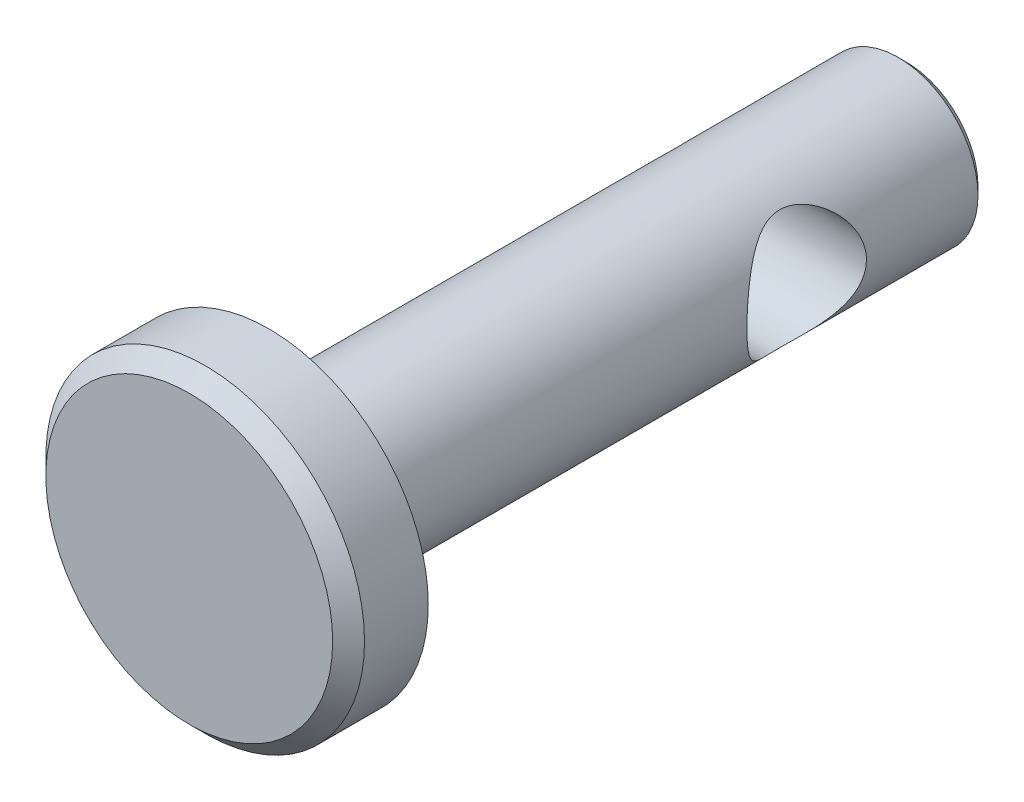
ISO-10303-21;
HEADER;
FILE_DESCRIPTION(('STEP AP214'),'2;1');
FILE_NAME('part.step','',(''),(''),'','','');
FILE_SCHEMA(('AUTOMOTIVE_DESIGN { 1 0 10303 214 1 1 1 1 }'));
ENDSEC;
DATA;
#1=APPLICATION_CONTEXT('core data for automotive mechanical design processes');
#2=APPLICATION_PROTOCOL_DEFINITION('international standard','automotive_design',2000,#1);
#3=PRODUCT_CONTEXT('',#1,'mechanical');
#4=PRODUCT('Part','Part','',(#3));
#5=PRODUCT_RELATED_PRODUCT_CATEGORY('part','',(#4));
#6=PRODUCT_DEFINITION_FORMATION('','',#4);
#7=PRODUCT_DEFINITION_CONTEXT('part definition',#1,'design');
#8=PRODUCT_DEFINITION('design','',#6,#7);
#9=PRODUCT_DEFINITION_SHAPE('','',#8);
#10=(LENGTH_UNIT() NAMED_UNIT(*) SI_UNIT(.MILLI.,.METRE.));
#11=(NAMED_UNIT(*) PLANE_ANGLE_UNIT() SI_UNIT($,.RADIAN.));
#12=(NAMED_UNIT(*) SI_UNIT($,.STERADIAN.) SOLID_ANGLE_UNIT());
#13=UNCERTAINTY_MEASURE_WITH_UNIT(LENGTH_MEASURE(1.E-05),#10,'distance_accuracy_value','');
#14=(GEOMETRIC_REPRESENTATION_CONTEXT(3) GLOBAL_UNCERTAINTY_ASSIGNED_CONTEXT((#13)) GLOBAL_UNIT_ASSIGNED_CONTEXT((#10,
#11,#12)) REPRESENTATION_CONTEXT('',''));
#15=CARTESIAN_POINT('',(0.,0.,0.));
#16=DIRECTION('',(0.,0.,1.));
#17=DIRECTION('',(1.,0.,0.));
#18=AXIS2_PLACEMENT_3D('',#15,#16,#17);
#19=CARTESIAN_POINT('',(0.,0.,6.35));
#20=DIRECTION('',(0.,0.,-1.));
#21=DIRECTION('',(-1.,0.,0.));
#22=AXIS2_PLACEMENT_3D('',#19,#20,#21);
#23=CYLINDRICAL_SURFACE('',#22,1.5875);
#24=CARTESIAN_POINT('',(0.,0.,-6.19125));
#25=DIRECTION('',(0.,0.,1.));
#26=DIRECTION('',(1.,0.,0.));
#27=AXIS2_PLACEMENT_3D('',#24,#25,#26);
#28=CIRCLE('',#27,1.5875);
#29=CARTESIAN_POINT('',(1.5875,0.,-6.19125));
#30=VERTEX_POINT('',#29);
#31=EDGE_CURVE('E39',#30,#30,#28,.T.);
#32=ORIENTED_EDGE('',*,*,#31,.T.);
#33=EDGE_LOOP('',(#32));
#34=FACE_BOUND('',#33,.T.);
#35=CARTESIAN_POINT('',(-1.5875,0.,-1.5875));
#36=CARTESIAN_POINT('',(-1.58749293550487,-0.0581345903619636,-1.58750751736506));
#37=CARTESIAN_POINT('',(-1.5842736454738,-0.116337035476692,-1.59179123415719));
#38=CARTESIAN_POINT('',(-1.57167836349025,-0.230926561501124,-1.60866598301441));
#39=CARTESIAN_POINT('',(-1.56228689316245,-0.287308703602339,-1.62127790062677));
#40=CARTESIAN_POINT('',(-1.53825292604917,-0.396268601409065,-1.65394738700866));
#41=CARTESIAN_POINT('',(-1.5236423654175,-0.448867207249459,-1.6739596976754));
#42=CARTESIAN_POINT('',(-1.49027010950212,-0.549609928884543,-1.72048666443958));
#43=CARTESIAN_POINT('',(-1.47150962872228,-0.597755342103896,-1.74699941838126));
#44=CARTESIAN_POINT('',(-1.42914323984027,-0.693313679409797,-1.80837128717648));
#45=CARTESIAN_POINT('',(-1.40524950621394,-0.740245900404435,-1.84377594851999));
#46=CARTESIAN_POINT('',(-1.35546320984701,-0.82790278963518,-1.92047481503523));
#47=CARTESIAN_POINT('',(-1.32956759006665,-0.868617669733832,-1.96177811276729));
#48=CARTESIAN_POINT('',(-1.27215204210137,-0.951207477538763,-2.0586564712163));
#49=CARTESIAN_POINT('',(-1.24055865999076,-0.991636468498788,-2.11542604425694));
#50=CARTESIAN_POINT('',(-1.1803970925182,-1.06252960824742,-2.23635174052509));
#51=CARTESIAN_POINT('',(-1.15182480849321,-1.0930073780619,-2.30049760312805));
#52=CARTESIAN_POINT('',(-1.11106866917438,-1.13411498357852,-2.41260537827536));
#53=CARTESIAN_POINT('',(-1.09662715003243,-1.14796629108587,-2.45855386586475));
#54=CARTESIAN_POINT('',(-1.0729245285833,-1.17015158839656,-2.55301173321647));
#55=CARTESIAN_POINT('',(-1.06365157402314,-1.17849820935624,-2.60151497243773));
#56=CARTESIAN_POINT('',(-1.0517485925154,-1.18913927577415,-2.70048242726543));
#57=CARTESIAN_POINT('',(-1.04917896183533,-1.19137870417301,-2.75096034031936));
#58=CARTESIAN_POINT('',(-1.05139753338266,-1.18942019258959,-2.85163808553011));
#59=CARTESIAN_POINT('',(-1.05618837351597,-1.18521994470442,-2.90183781151625));
#60=CARTESIAN_POINT('',(-1.07130550994751,-1.17155705567151,-2.99497063193861));
#61=CARTESIAN_POINT('',(-1.08098556023457,-1.16270473579084,-3.03810699425691));
#62=CARTESIAN_POINT('',(-1.10421890680931,-1.14066376466568,-3.12216710972328));
#63=CARTESIAN_POINT('',(-1.11777592426019,-1.12747094551454,-3.16308869200372));
#64=CARTESIAN_POINT('',(-1.15682529319326,-1.08769994678833,-3.26727850704296));
#65=CARTESIAN_POINT('',(-1.18447858988687,-1.05791117864918,-3.32851158075162));
#66=CARTESIAN_POINT('',(-1.24248305418366,-0.989155560080841,-3.44423724078015));
#67=CARTESIAN_POINT('',(-1.2728406637008,-0.950166408786953,-3.4987129505223));
#68=CARTESIAN_POINT('',(-1.33391014894222,-0.862422107554635,-3.60184175364427));
#69=CARTESIAN_POINT('',(-1.36461171965975,-0.813445918236304,-3.6503138567152));
#70=CARTESIAN_POINT('',(-1.42278130148547,-0.706772876608597,-3.73877176962953));
#71=CARTESIAN_POINT('',(-1.45025545184636,-0.649093074346057,-3.77877381168214));
#72=CARTESIAN_POINT('',(-1.49447032570734,-0.538084776360168,-3.84173475939759));
#73=CARTESIAN_POINT('',(-1.51225861937541,-0.486203521959755,-3.86650277165893));
#74=CARTESIAN_POINT('',(-1.54283492881011,-0.37810453747924,-3.90860349886804));
#75=CARTESIAN_POINT('',(-1.55562607581595,-0.321889549469388,-3.92594087055876));
#76=CARTESIAN_POINT('',(-1.57516185979801,-0.206118009533772,-3.95228235679115));
#77=CARTESIAN_POINT('',(-1.58186908171322,-0.146543142115963,-3.96123491703255));
#78=CARTESIAN_POINT('',(-1.58841982654688,-0.0263534840888105,-3.96997999291378));
#79=CARTESIAN_POINT('',(-1.58826624533544,0.0342608569708462,-3.96977637327694));
#80=CARTESIAN_POINT('',(-1.58148771820849,0.14827584750539,-3.96072449751441));
#81=CARTESIAN_POINT('',(-1.57551506239068,0.201788972489742,-3.95274757384462));
#82=CARTESIAN_POINT('',(-1.55853860410011,0.306475344795986,-3.92987706211876));
#83=CARTESIAN_POINT('',(-1.54753373108889,0.357648091683638,-3.91498200230903));
#84=CARTESIAN_POINT('',(-1.5208236560488,0.458324568878753,-3.87835177259173));
#85=CARTESIAN_POINT('',(-1.50496627417841,0.507705655700557,-3.85639374974201));
#86=CARTESIAN_POINT('',(-1.46976294670745,0.60207408084044,-3.80668811350594));
#87=CARTESIAN_POINT('',(-1.45041651854828,0.647060810060777,-3.77893969918596));
#88=CARTESIAN_POINT('',(-1.40588322841159,0.739387353390724,-3.71333454816161));
#89=CARTESIAN_POINT('',(-1.38026056676124,0.785865492892053,-3.67456359682151));
#90=CARTESIAN_POINT('',(-1.32745918844359,0.872108800418378,-3.59091805263298));
#91=CARTESIAN_POINT('',(-1.3002771056524,0.911858654352413,-3.54602994461845));
#92=CARTESIAN_POINT('',(-1.24117995581381,0.991215482287605,-3.441581031987));
#93=CARTESIAN_POINT('',(-1.20934732825353,1.02935915896087,-3.38085306056522));
#94=CARTESIAN_POINT('',(-1.15046594382809,1.09476568573709,-3.25170793810963));
#95=CARTESIAN_POINT('',(-1.1234031028437,1.12206087909462,-3.18331443448606));
#96=CARTESIAN_POINT('',(-1.08838109260616,1.15582489066144,-3.06751478120528));
#97=CARTESIAN_POINT('',(-1.07708550635911,1.16626488800437,-3.02228954341626));
#98=CARTESIAN_POINT('',(-1.05999007031602,1.1818264573239,-2.92996378145895));
#99=CARTESIAN_POINT('',(-1.05417795592964,1.18695990066239,-2.8828676889825));
#100=CARTESIAN_POINT('',(-1.04900096423164,1.19154035414093,-2.78778566789294));
#101=CARTESIAN_POINT('',(-1.04966881670936,1.19095849657507,-2.73979644521068));
#102=CARTESIAN_POINT('',(-1.05740556029295,1.18409151553515,-2.64472988426598));
#103=CARTESIAN_POINT('',(-1.06448271154137,1.17779903232889,-2.59765380282681));
#104=CARTESIAN_POINT('',(-1.08598770618424,1.15803236912881,-2.49561780882663));
#105=CARTESIAN_POINT('',(-1.10168297890217,1.14329025684,-2.44118036279259));
#106=CARTESIAN_POINT('',(-1.13810227145168,1.10704016772387,-2.33637546421904));
#107=CARTESIAN_POINT('',(-1.15883896333654,1.08551510031168,-2.28601870093093));
#108=CARTESIAN_POINT('',(-1.21059954092525,1.02789766245492,-2.17287424712876));
#109=CARTESIAN_POINT('',(-1.24269662205451,0.989342211616041,-2.1118341081835));
#110=CARTESIAN_POINT('',(-1.30741347783049,0.902102606381482,-1.99776871231258));
#111=CARTESIAN_POINT('',(-1.34003369413069,0.853409427337072,-1.9447506698021));
#112=CARTESIAN_POINT('',(-1.40278638481485,0.74582893771658,-1.84718968521524));
#113=CARTESIAN_POINT('',(-1.43289615544478,0.686860964920876,-1.80272014663381));
#114=CARTESIAN_POINT('',(-1.48714835544475,0.559720440868621,-1.72464185265254));
#115=CARTESIAN_POINT('',(-1.5113049999054,0.491570429282554,-1.69100716517885));
#116=CARTESIAN_POINT('',(-1.54492918912427,0.36896590978973,-1.64480881542714));
#117=CARTESIAN_POINT('',(-1.55662680105537,0.316348479361373,-1.6289588859998));
#118=CARTESIAN_POINT('',(-1.57466982293622,0.208633970914951,-1.60463205720135));
#119=CARTESIAN_POINT('',(-1.58103017903459,0.153544275563068,-1.59613456638521));
#120=CARTESIAN_POINT('',(-1.58648947610023,0.0654477992947602,-1.58884736125639));
#121=CARTESIAN_POINT('',(-1.58750397790407,0.0327346567825816,-1.58749576709213));
#122=CARTESIAN_POINT('',(-1.5875,0.,-1.5875));
#123=B_SPLINE_CURVE_WITH_KNOTS('',3,(#35,#36,#37,#38,#39,#40,#41,#42,#43,#44,#45,#46,#47,#48,
#49,#50,#51,#52,#53,#54,#55,#56,#57,#58,#59,#60,#61,#62,#63,#64,#65,#66,#67,#68,#69,#70,#71,#72,
#73,#74,#75,#76,#77,#78,#79,#80,#81,#82,#83,#84,#85,#86,#87,#88,#89,#90,#91,#92,#93,#94,#95,#96,
#97,#98,#99,#100,#101,#102,#103,#104,#105,#106,#107,#108,#109,#110,#111,#112,#113,#114,#115,
#116,#117,#118,#119,#120,#121,#122),.UNSPECIFIED.,.T.,.F.,(4,2,2,2,2,2,2,2,2,2,2,2,2,2,2,2,2,2,
2,2,2,2,2,2,2,2,2,2,2,2,2,2,2,2,2,2,2,2,2,2,2,2,2,4),(0.,0.174285105591558,0.3490089535422,
0.522681464773872,0.696303216586626,0.886003048582098,1.07599851796598,1.30460762610664,
1.53290249407352,1.68274617833109,1.83224482098762,1.98308585174373,2.13398095475791,
2.26875094061606,2.40365071711279,2.62294157111712,2.84276952674846,3.06812857866631,
3.29305175845138,3.47286663339593,3.65256865394996,3.83336846160747,4.01409195636146,
4.17664254681542,4.3392277338826,4.50755098830942,4.67589754085445,4.87235803268254,
5.06925983997974,5.30358823078429,5.53721266696798,5.67998896870224,5.82244516787674,
5.96562127487972,6.10898216663331,6.28363988815378,6.45874125070584,6.69458470773787,
6.93063901826043,7.16863763025562,7.40606231082595,7.5739283491444,7.74132272115606,
7.83945987286443),.UNSPECIFIED.);
#124=CARTESIAN_POINT('',(-1.5875,0.,-1.5875));
#125=VERTEX_POINT('',#124);
#126=EDGE_CURVE('E50',#125,#125,#123,.T.);
#127=ORIENTED_EDGE('',*,*,#126,.T.);
#128=EDGE_LOOP('',(#127));
#129=FACE_BOUND('',#128,.T.);
#130=CARTESIAN_POINT('',(1.5875,0.,-3.96875));
#131=CARTESIAN_POINT('',(1.58749293550487,-0.0581345903619637,-3.96874248263494));
#132=CARTESIAN_POINT('',(1.5842736454738,-0.116337035476692,-3.96445876584281));
#133=CARTESIAN_POINT('',(1.57167836349025,-0.230926561501124,-3.94758401698559));
#134=CARTESIAN_POINT('',(1.56228689316245,-0.287308703602339,-3.93497209937323));
#135=CARTESIAN_POINT('',(1.53825292604917,-0.396268601409065,-3.90230261299134));
#136=CARTESIAN_POINT('',(1.5236423654175,-0.448867207249459,-3.8822903023246));
#137=CARTESIAN_POINT('',(1.49027010950212,-0.549609928884543,-3.83576333556042));
#138=CARTESIAN_POINT('',(1.47150962872228,-0.597755342103897,-3.80925058161874));
#139=CARTESIAN_POINT('',(1.42914323984027,-0.693313679409798,-3.74787871282352));
#140=CARTESIAN_POINT('',(1.40524950621394,-0.740245900404435,-3.71247405148001));
#141=CARTESIAN_POINT('',(1.35546320984701,-0.82790278963518,-3.63577518496477));
#142=CARTESIAN_POINT('',(1.32956759006665,-0.868617669733832,-3.59447188723271));
#143=CARTESIAN_POINT('',(1.27215204210136,-0.951207477538763,-3.4975935287837));
#144=CARTESIAN_POINT('',(1.24055865999076,-0.991636468498789,-3.44082395574305));
#145=CARTESIAN_POINT('',(1.1803970925182,-1.06252960824742,-3.3198982594749));
#146=CARTESIAN_POINT('',(1.15182480849321,-1.0930073780619,-3.25575239687195));
#147=CARTESIAN_POINT('',(1.11106866917438,-1.13411498357852,-3.14364462172464));
#148=CARTESIAN_POINT('',(1.09662715003243,-1.14796629108587,-3.09769613413525));
#149=CARTESIAN_POINT('',(1.0729245285833,-1.17015158839656,-3.00323826678353));
#150=CARTESIAN_POINT('',(1.06365157402314,-1.17849820935624,-2.95473502756227));
#151=CARTESIAN_POINT('',(1.0517485925154,-1.18913927577415,-2.85576757273457));
#152=CARTESIAN_POINT('',(1.04917896183533,-1.19137870417301,-2.80528965968064));
#153=CARTESIAN_POINT('',(1.05139753338266,-1.18942019258959,-2.70461191446989));
#154=CARTESIAN_POINT('',(1.05618837351597,-1.18521994470442,-2.65441218848375));
#155=CARTESIAN_POINT('',(1.07130550994751,-1.17155705567151,-2.56127936806139));
#156=CARTESIAN_POINT('',(1.08098556023457,-1.16270473579084,-2.51814300574309));
#157=CARTESIAN_POINT('',(1.10421890680931,-1.14066376466568,-2.43408289027672));
#158=CARTESIAN_POINT('',(1.11777592426019,-1.12747094551454,-2.39316130799628));
#159=CARTESIAN_POINT('',(1.15682529319326,-1.08769994678833,-2.28897149295704));
#160=CARTESIAN_POINT('',(1.18447858988687,-1.05791117864918,-2.22773841924838));
#161=CARTESIAN_POINT('',(1.24248305418366,-0.989155560080841,-2.11201275921985));
#162=CARTESIAN_POINT('',(1.2728406637008,-0.950166408786953,-2.0575370494777));
#163=CARTESIAN_POINT('',(1.33391014894222,-0.862422107554635,-1.95440824635573));
#164=CARTESIAN_POINT('',(1.36461171965975,-0.813445918236304,-1.9059361432848));
#165=CARTESIAN_POINT('',(1.42278130148547,-0.706772876608597,-1.81747823037047));
#166=CARTESIAN_POINT('',(1.45025545184636,-0.649093074346057,-1.77747618831786));
#167=CARTESIAN_POINT('',(1.49447032570734,-0.538084776360169,-1.71451524060241));
#168=CARTESIAN_POINT('',(1.51225861937541,-0.486203521959755,-1.68974722834107));
#169=CARTESIAN_POINT('',(1.54283492881011,-0.378104537479241,-1.64764650113196));
#170=CARTESIAN_POINT('',(1.55562607581595,-0.321889549469389,-1.63030912944124));
#171=CARTESIAN_POINT('',(1.57516185979801,-0.206118009533772,-1.60396764320884));
#172=CARTESIAN_POINT('',(1.58186908171322,-0.146543142115963,-1.59501508296745));
#173=CARTESIAN_POINT('',(1.58841982654688,-0.0263534840888108,-1.58627000708622));
#174=CARTESIAN_POINT('',(1.58826624533544,0.034260856970846,-1.58647362672305));
#175=CARTESIAN_POINT('',(1.58148771820849,0.14827584750539,-1.59552550248559));
#176=CARTESIAN_POINT('',(1.57551506239068,0.201788972489742,-1.60350242615538));
#177=CARTESIAN_POINT('',(1.55853860410011,0.306475344795985,-1.62637293788124));
#178=CARTESIAN_POINT('',(1.54753373108889,0.357648091683637,-1.64126799769097));
#179=CARTESIAN_POINT('',(1.5208236560488,0.458324568878752,-1.67789822740827));
#180=CARTESIAN_POINT('',(1.50496627417841,0.507705655700557,-1.69985625025799));
#181=CARTESIAN_POINT('',(1.46976294670745,0.60207408084044,-1.74956188649406));
#182=CARTESIAN_POINT('',(1.45041651854828,0.647060810060777,-1.77731030081403));
#183=CARTESIAN_POINT('',(1.40588322841159,0.739387353390724,-1.84291545183839));
#184=CARTESIAN_POINT('',(1.38026056676124,0.785865492892054,-1.88168640317849));
#185=CARTESIAN_POINT('',(1.32745918844359,0.872108800418379,-1.96533194736702));
#186=CARTESIAN_POINT('',(1.3002771056524,0.911858654352413,-2.01022005538155));
#187=CARTESIAN_POINT('',(1.24117995581381,0.991215482287605,-2.114668968013));
#188=CARTESIAN_POINT('',(1.20934732825353,1.02935915896087,-2.17539693943478));
#189=CARTESIAN_POINT('',(1.15046594382809,1.09476568573709,-2.30454206189037));
#190=CARTESIAN_POINT('',(1.1234031028437,1.12206087909462,-2.37293556551394));
#191=CARTESIAN_POINT('',(1.08838109260616,1.15582489066144,-2.48873521879472));
#192=CARTESIAN_POINT('',(1.07708550635911,1.16626488800437,-2.53396045658374));
#193=CARTESIAN_POINT('',(1.05999007031602,1.1818264573239,-2.62628621854105));
#194=CARTESIAN_POINT('',(1.05417795592964,1.18695990066239,-2.6733823110175));
#195=CARTESIAN_POINT('',(1.04900096423164,1.19154035414093,-2.76846433210706));
#196=CARTESIAN_POINT('',(1.04966881670936,1.19095849657507,-2.81645355478932));
#197=CARTESIAN_POINT('',(1.05740556029295,1.18409151553515,-2.91152011573401));
#198=CARTESIAN_POINT('',(1.06448271154137,1.17779903232889,-2.95859619717319));
#199=CARTESIAN_POINT('',(1.08598770618424,1.15803236912881,-3.06063219117337));
#200=CARTESIAN_POINT('',(1.10168297890217,1.14329025684,-3.11506963720741));
#201=CARTESIAN_POINT('',(1.13810227145168,1.10704016772387,-3.21987453578096));
#202=CARTESIAN_POINT('',(1.15883896333654,1.08551510031168,-3.27023129906907));
#203=CARTESIAN_POINT('',(1.21059954092525,1.02789766245492,-3.38337575287124));
#204=CARTESIAN_POINT('',(1.24269662205451,0.989342211616041,-3.4444158918165));
#205=CARTESIAN_POINT('',(1.30741347783049,0.902102606381482,-3.55848128768742));
#206=CARTESIAN_POINT('',(1.34003369413069,0.853409427337072,-3.6114993301979));
#207=CARTESIAN_POINT('',(1.40278638481485,0.745828937716579,-3.70906031478476));
#208=CARTESIAN_POINT('',(1.43289615544478,0.686860964920874,-3.75352985336619));
#209=CARTESIAN_POINT('',(1.48714835544475,0.55972044086862,-3.83160814734746));
#210=CARTESIAN_POINT('',(1.5113049999054,0.491570429282554,-3.86524283482115));
#211=CARTESIAN_POINT('',(1.54492918912427,0.368965909789729,-3.91144118457286));
#212=CARTESIAN_POINT('',(1.55662680105537,0.316348479361372,-3.9272911140002));
#213=CARTESIAN_POINT('',(1.57466982293622,0.208633970914951,-3.95161794279865));
#214=CARTESIAN_POINT('',(1.58103017903459,0.153544275563067,-3.96011543361479));
#215=CARTESIAN_POINT('',(1.58648947610023,0.0654477992947596,-3.96740263874361));
#216=CARTESIAN_POINT('',(1.58750397790407,0.0327346567825813,-3.96875423290787));
#217=CARTESIAN_POINT('',(1.5875,0.,-3.96875));
#218=B_SPLINE_CURVE_WITH_KNOTS('',3,(#130,#131,#132,#133,#134,#135,#136,#137,#138,#139,#140,
#141,#142,#143,#144,#145,#146,#147,#148,#149,#150,#151,#152,#153,#154,#155,#156,#157,#158,#159,
#160,#161,#162,#163,#164,#165,#166,#167,#168,#169,#170,#171,#172,#173,#174,#175,#176,#177,#178,
#179,#180,#181,#182,#183,#184,#185,#186,#187,#188,#189,#190,#191,#192,#193,#194,#195,#196,#197,
#198,#199,#200,#201,#202,#203,#204,#205,#206,#207,#208,#209,#210,#211,#212,#213,#214,#215,#216,
#217),.UNSPECIFIED.,.T.,.F.,(4,2,2,2,2,2,2,2,2,2,2,2,2,2,2,2,2,2,2,2,2,2,2,2,2,2,2,2,2,2,2,2,2,
2,2,2,2,2,2,2,2,2,2,4),(0.,0.174285105591558,0.3490089535422,0.522681464773872,
0.696303216586627,0.886003048582098,1.07599851796598,1.30460762610664,1.53290249407352,
1.68274617833109,1.83224482098762,1.98308585174373,2.13398095475791,2.26875094061606,
2.40365071711279,2.62294157111712,2.84276952674846,3.06812857866631,3.29305175845139,
3.47286663339593,3.65256865394996,3.83336846160747,4.01409195636146,4.17664254681542,
4.3392277338826,4.50755098830942,4.67589754085445,4.87235803268254,5.06925983997974,
5.30358823078429,5.53721266696798,5.67998896870224,5.82244516787674,5.96562127487972,
6.10898216663331,6.28363988815378,6.45874125070584,6.69458470773787,6.93063901826043,
7.16863763025562,7.40606231082595,7.5739283491444,7.74132272115606,7.83945987286442),.UNSPECIFIED.);
#219=CARTESIAN_POINT('',(1.5875,0.,-3.96875));
#220=VERTEX_POINT('',#219);
#221=EDGE_CURVE('E59',#220,#220,#218,.T.);
#222=ORIENTED_EDGE('',*,*,#221,.T.);
#223=EDGE_LOOP('',(#222));
#224=FACE_BOUND('',#223,.T.);
#225=CARTESIAN_POINT('',(0.,0.,6.35));
#226=DIRECTION('',(0.,0.,1.));
#227=DIRECTION('',(1.,0.,0.));
#228=AXIS2_PLACEMENT_3D('',#225,#226,#227);
#229=CIRCLE('',#228,1.5875);
#230=CARTESIAN_POINT('',(1.5875,0.,6.35));
#231=VERTEX_POINT('',#230);
#232=EDGE_CURVE('E98',#231,#231,#229,.T.);
#233=ORIENTED_EDGE('',*,*,#232,.F.);
#234=EDGE_LOOP('',(#233));
#235=FACE_BOUND('',#234,.T.);
#236=ADVANCED_FACE('F32',(#34,#129,#224,#235),#23,.T.);
#237=CARTESIAN_POINT('',(0.,0.,-6.35));
#238=DIRECTION('',(0.,0.,1.));
#239=DIRECTION('',(1.,0.,0.));
#240=AXIS2_PLACEMENT_3D('',#237,#238,#239);
#241=PLANE('',#240);
#242=CARTESIAN_POINT('',(0.,0.,-6.35));
#243=DIRECTION('',(0.,0.,1.));
#244=DIRECTION('',(1.,0.,0.));
#245=AXIS2_PLACEMENT_3D('',#242,#243,#244);
#246=CIRCLE('',#245,1.42875);
#247=CARTESIAN_POINT('',(1.42875,0.,-6.35));
#248=VERTEX_POINT('',#247);
#249=EDGE_CURVE('E10',#248,#248,#246,.F.);
#250=ORIENTED_EDGE('',*,*,#249,.T.);
#251=EDGE_LOOP('',(#250));
#252=FACE_BOUND('',#251,.T.);
#253=ADVANCED_FACE('F80',(#252),#241,.F.);
#254=CARTESIAN_POINT('',(0.,0.,6.35));
#255=DIRECTION('',(0.,0.,1.));
#256=DIRECTION('',(1.,0.,0.));
#257=AXIS2_PLACEMENT_3D('',#254,#255,#256);
#258=PLANE('',#257);
#259=CARTESIAN_POINT('',(0.,0.,6.35));
#260=DIRECTION('',(0.,0.,1.));
#261=DIRECTION('',(1.,0.,0.));
#262=AXIS2_PLACEMENT_3D('',#259,#260,#261);
#263=CIRCLE('',#262,3.175);
#264=CARTESIAN_POINT('',(3.175,0.,6.35));
#265=VERTEX_POINT('',#264);
#266=EDGE_CURVE('E58',#265,#265,#263,.T.);
#267=ORIENTED_EDGE('',*,*,#266,.F.);
#268=EDGE_LOOP('',(#267));
#269=FACE_BOUND('',#268,.T.);
#270=ORIENTED_EDGE('',*,*,#232,.T.);
#271=EDGE_LOOP('',(#270));
#272=FACE_BOUND('',#271,.T.);
#273=ADVANCED_FACE('F77',(#269,#272),#258,.F.);
#274=CARTESIAN_POINT('',(0.,0.,7.9375));
#275=DIRECTION('',(0.,0.,-1.));
#276=DIRECTION('',(-1.,0.,0.));
#277=AXIS2_PLACEMENT_3D('',#274,#275,#276);
#278=CYLINDRICAL_SURFACE('',#277,3.175);
#279=CARTESIAN_POINT('',(0.,0.,7.62));
#280=DIRECTION('',(0.,0.,1.));
#281=DIRECTION('',(1.,0.,0.));
#282=AXIS2_PLACEMENT_3D('',#279,#280,#281);
#283=CIRCLE('',#282,3.175);
#284=CARTESIAN_POINT('',(3.175,0.,7.62));
#285=VERTEX_POINT('',#284);
#286=EDGE_CURVE('E43',#285,#285,#283,.F.);
#287=ORIENTED_EDGE('',*,*,#286,.T.);
#288=EDGE_LOOP('',(#287));
#289=FACE_BOUND('',#288,.T.);
#290=ORIENTED_EDGE('',*,*,#266,.T.);
#291=EDGE_LOOP('',(#290));
#292=FACE_BOUND('',#291,.T.);
#293=ADVANCED_FACE('F75',(#289,#292),#278,.T.);
#294=CARTESIAN_POINT('',(0.,0.,7.9375));
#295=DIRECTION('',(0.,0.,1.));
#296=DIRECTION('',(1.,0.,0.));
#297=AXIS2_PLACEMENT_3D('',#294,#295,#296);
#298=PLANE('',#297);
#299=CARTESIAN_POINT('',(0.,0.,7.9375));
#300=DIRECTION('',(0.,0.,1.));
#301=DIRECTION('',(1.,0.,0.));
#302=AXIS2_PLACEMENT_3D('',#299,#300,#301);
#303=CIRCLE('',#302,2.8575);
#304=CARTESIAN_POINT('',(2.8575,0.,7.9375));
#305=VERTEX_POINT('',#304);
#306=EDGE_CURVE('E47',#305,#305,#303,.T.);
#307=ORIENTED_EDGE('',*,*,#306,.T.);
#308=EDGE_LOOP('',(#307));
#309=FACE_BOUND('',#308,.T.);
#310=ADVANCED_FACE('F71',(#309),#298,.T.);
#311=CARTESIAN_POINT('',(0.,0.,7.9375));
#312=DIRECTION('',(0.,0.,-1.));
#313=DIRECTION('',(-1.,0.,0.));
#314=AXIS2_PLACEMENT_3D('',#311,#312,#313);
#315=CONICAL_SURFACE('',#314,2.8575,0.785398163397445);
#316=ORIENTED_EDGE('',*,*,#286,.F.);
#317=EDGE_LOOP('',(#316));
#318=FACE_BOUND('',#317,.T.);
#319=ORIENTED_EDGE('',*,*,#306,.F.);
#320=EDGE_LOOP('',(#319));
#321=FACE_BOUND('',#320,.T.);
#322=ADVANCED_FACE('F69',(#318,#321),#315,.T.);
#323=CARTESIAN_POINT('',(-3.175,0.,-2.778125));
#324=DIRECTION('',(1.,0.,0.));
#325=DIRECTION('',(0.,0.,-1.));
#326=AXIS2_PLACEMENT_3D('',#323,#324,#325);
#327=CYLINDRICAL_SURFACE('',#326,1.190625);
#328=ORIENTED_EDGE('',*,*,#221,.F.);
#329=EDGE_LOOP('',(#328));
#330=FACE_BOUND('',#329,.T.);
#331=ORIENTED_EDGE('',*,*,#126,.F.);
#332=EDGE_LOOP('',(#331));
#333=FACE_BOUND('',#332,.T.);
#334=ADVANCED_FACE('F65',(#330,#333),#327,.F.);
#335=CARTESIAN_POINT('',(0.,0.,-6.19125));
#336=DIRECTION('',(0.,0.,1.));
#337=DIRECTION('',(1.,0.,0.));
#338=AXIS2_PLACEMENT_3D('',#335,#336,#337);
#339=CONICAL_SURFACE('',#338,1.5875,0.785398163397449);
#340=ORIENTED_EDGE('',*,*,#249,.F.);
#341=EDGE_LOOP('',(#340));
#342=FACE_BOUND('',#341,.T.);
#343=ORIENTED_EDGE('',*,*,#31,.F.);
#344=EDGE_LOOP('',(#343));
#345=FACE_BOUND('',#344,.T.);
#346=ADVANCED_FACE('F34',(#342,#345),#339,.T.);
#347=CLOSED_SHELL('',(#236,#253,#273,#293,#310,#322,#334,#346));
#348=MANIFOLD_SOLID_BREP('B2',#347);
#349=ADVANCED_BREP_SHAPE_REPRESENTATION('',(#18,#348),#14);
#350=SHAPE_DEFINITION_REPRESENTATION(#9,#349);
ENDSEC;
END-ISO-10303-21;
